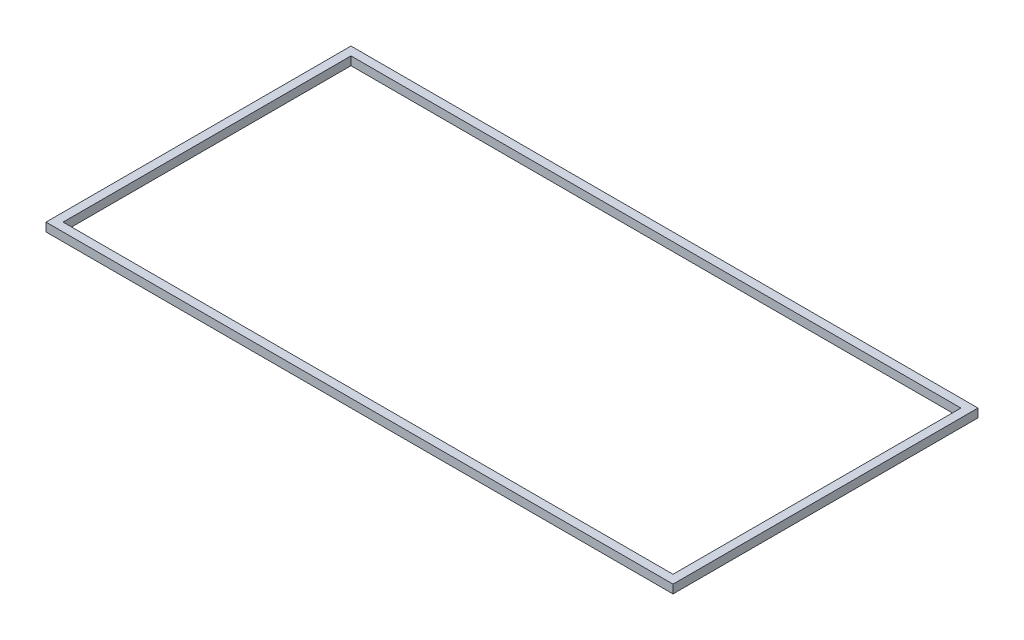
ISO-10303-21;
HEADER;
FILE_DESCRIPTION(('STEP AP214'),'2;1');
FILE_NAME('part.step','',(''),(''),'','','');
FILE_SCHEMA(('AUTOMOTIVE_DESIGN { 1 0 10303 214 1 1 1 1 }'));
ENDSEC;
DATA;
#1=APPLICATION_CONTEXT('core data for automotive mechanical design processes');
#2=APPLICATION_PROTOCOL_DEFINITION('international standard','automotive_design',2000,#1);
#3=PRODUCT_CONTEXT('',#1,'mechanical');
#4=PRODUCT('Part','Part','',(#3));
#5=PRODUCT_RELATED_PRODUCT_CATEGORY('part','',(#4));
#6=PRODUCT_DEFINITION_FORMATION('','',#4);
#7=PRODUCT_DEFINITION_CONTEXT('part definition',#1,'design');
#8=PRODUCT_DEFINITION('design','',#6,#7);
#9=PRODUCT_DEFINITION_SHAPE('','',#8);
#10=(LENGTH_UNIT() NAMED_UNIT(*) SI_UNIT(.MILLI.,.METRE.));
#11=(NAMED_UNIT(*) PLANE_ANGLE_UNIT() SI_UNIT($,.RADIAN.));
#12=(NAMED_UNIT(*) SI_UNIT($,.STERADIAN.) SOLID_ANGLE_UNIT());
#13=UNCERTAINTY_MEASURE_WITH_UNIT(LENGTH_MEASURE(1.E-05),#10,'distance_accuracy_value','');
#14=(GEOMETRIC_REPRESENTATION_CONTEXT(3) GLOBAL_UNCERTAINTY_ASSIGNED_CONTEXT((#13)) GLOBAL_UNIT_ASSIGNED_CONTEXT((#10,
#11,#12)) REPRESENTATION_CONTEXT('',''));
#15=CARTESIAN_POINT('',(0.,0.,0.));
#16=DIRECTION('',(0.,0.,1.));
#17=DIRECTION('',(1.,0.,0.));
#18=AXIS2_PLACEMENT_3D('',#15,#16,#17);
#19=CARTESIAN_POINT('',(0.,14.,0.));
#20=DIRECTION('',(0.,0.,1.));
#21=DIRECTION('',(1.,0.,0.));
#22=AXIS2_PLACEMENT_3D('',#19,#20,#21);
#23=PLANE('',#22);
#24=DIRECTION('',(-1.,0.,0.));
#25=VECTOR('',#24,1.);
#26=CARTESIAN_POINT('',(0.,0.,0.));
#27=LINE('',#26,#25);
#28=CARTESIAN_POINT('',(0.,0.,0.));
#29=VERTEX_POINT('',#28);
#30=CARTESIAN_POINT('',(-1028.,0.,0.));
#31=VERTEX_POINT('',#30);
#32=EDGE_CURVE('E129',#29,#31,#27,.T.);
#33=ORIENTED_EDGE('',*,*,#32,.T.);
#34=DIRECTION('',(0.,-1.,0.));
#35=VECTOR('',#34,1.);
#36=CARTESIAN_POINT('',(-1028.,14.,0.));
#37=LINE('',#36,#35);
#38=CARTESIAN_POINT('',(-1028.,14.,0.));
#39=VERTEX_POINT('',#38);
#40=EDGE_CURVE('E12',#39,#31,#37,.T.);
#41=ORIENTED_EDGE('',*,*,#40,.F.);
#42=DIRECTION('',(-1.,0.,0.));
#43=VECTOR('',#42,1.);
#44=CARTESIAN_POINT('',(0.,14.,0.));
#45=LINE('',#44,#43);
#46=CARTESIAN_POINT('',(0.,14.,0.));
#47=VERTEX_POINT('',#46);
#48=EDGE_CURVE('E158',#47,#39,#45,.T.);
#49=ORIENTED_EDGE('',*,*,#48,.F.);
#50=DIRECTION('',(0.,-1.,0.));
#51=VECTOR('',#50,1.);
#52=CARTESIAN_POINT('',(0.,14.,0.));
#53=LINE('',#52,#51);
#54=EDGE_CURVE('E170',#47,#29,#53,.T.);
#55=ORIENTED_EDGE('',*,*,#54,.T.);
#56=EDGE_LOOP('',(#33,#41,#49,#55));
#57=FACE_BOUND('',#56,.T.);
#58=ADVANCED_FACE('F57',(#57),#23,.F.);
#59=CARTESIAN_POINT('',(-1028.,14.,0.));
#60=DIRECTION('',(1.,0.,0.));
#61=DIRECTION('',(0.,0.,-1.));
#62=AXIS2_PLACEMENT_3D('',#59,#60,#61);
#63=PLANE('',#62);
#64=DIRECTION('',(0.,0.,1.));
#65=VECTOR('',#64,1.);
#66=CARTESIAN_POINT('',(-1028.,0.,0.));
#67=LINE('',#66,#65);
#68=CARTESIAN_POINT('',(-1028.,0.,500.));
#69=VERTEX_POINT('',#68);
#70=EDGE_CURVE('E173',#31,#69,#67,.T.);
#71=ORIENTED_EDGE('',*,*,#70,.T.);
#72=DIRECTION('',(0.,-1.,0.));
#73=VECTOR('',#72,1.);
#74=CARTESIAN_POINT('',(-1028.,14.,500.));
#75=LINE('',#74,#73);
#76=CARTESIAN_POINT('',(-1028.,14.,500.));
#77=VERTEX_POINT('',#76);
#78=EDGE_CURVE('E64',#77,#69,#75,.T.);
#79=ORIENTED_EDGE('',*,*,#78,.F.);
#80=DIRECTION('',(0.,0.,1.));
#81=VECTOR('',#80,1.);
#82=CARTESIAN_POINT('',(-1028.,14.,0.));
#83=LINE('',#82,#81);
#84=EDGE_CURVE('E161',#39,#77,#83,.T.);
#85=ORIENTED_EDGE('',*,*,#84,.F.);
#86=ORIENTED_EDGE('',*,*,#40,.T.);
#87=EDGE_LOOP('',(#71,#79,#85,#86));
#88=FACE_BOUND('',#87,.T.);
#89=ADVANCED_FACE('F189',(#88),#63,.F.);
#90=CARTESIAN_POINT('',(0.,14.,500.));
#91=DIRECTION('',(0.,0.,1.));
#92=DIRECTION('',(1.,0.,0.));
#93=AXIS2_PLACEMENT_3D('',#90,#91,#92);
#94=PLANE('',#93);
#95=DIRECTION('',(-1.,0.,0.));
#96=VECTOR('',#95,1.);
#97=CARTESIAN_POINT('',(0.,0.,500.));
#98=LINE('',#97,#96);
#99=CARTESIAN_POINT('',(0.,0.,500.));
#100=VERTEX_POINT('',#99);
#101=EDGE_CURVE('E176',#100,#69,#98,.T.);
#102=ORIENTED_EDGE('',*,*,#101,.F.);
#103=DIRECTION('',(0.,-1.,0.));
#104=VECTOR('',#103,1.);
#105=CARTESIAN_POINT('',(0.,14.,500.));
#106=LINE('',#105,#104);
#107=CARTESIAN_POINT('',(0.,14.,500.));
#108=VERTEX_POINT('',#107);
#109=EDGE_CURVE('E182',#108,#100,#106,.T.);
#110=ORIENTED_EDGE('',*,*,#109,.F.);
#111=DIRECTION('',(-1.,0.,0.));
#112=VECTOR('',#111,1.);
#113=CARTESIAN_POINT('',(0.,14.,500.));
#114=LINE('',#113,#112);
#115=EDGE_CURVE('E164',#108,#77,#114,.T.);
#116=ORIENTED_EDGE('',*,*,#115,.T.);
#117=ORIENTED_EDGE('',*,*,#78,.T.);
#118=EDGE_LOOP('',(#102,#110,#116,#117));
#119=FACE_BOUND('',#118,.T.);
#120=ADVANCED_FACE('F186',(#119),#94,.T.);
#121=CARTESIAN_POINT('',(0.,14.,0.));
#122=DIRECTION('',(1.,0.,0.));
#123=DIRECTION('',(0.,0.,-1.));
#124=AXIS2_PLACEMENT_3D('',#121,#122,#123);
#125=PLANE('',#124);
#126=DIRECTION('',(0.,0.,1.));
#127=VECTOR('',#126,1.);
#128=CARTESIAN_POINT('',(0.,0.,0.));
#129=LINE('',#128,#127);
#130=EDGE_CURVE('E162',#29,#100,#129,.T.);
#131=ORIENTED_EDGE('',*,*,#130,.F.);
#132=ORIENTED_EDGE('',*,*,#54,.F.);
#133=DIRECTION('',(0.,0.,1.));
#134=VECTOR('',#133,1.);
#135=CARTESIAN_POINT('',(0.,14.,0.));
#136=LINE('',#135,#134);
#137=EDGE_CURVE('E167',#47,#108,#136,.T.);
#138=ORIENTED_EDGE('',*,*,#137,.T.);
#139=ORIENTED_EDGE('',*,*,#109,.T.);
#140=EDGE_LOOP('',(#131,#132,#138,#139));
#141=FACE_BOUND('',#140,.T.);
#142=ADVANCED_FACE('F196',(#141),#125,.T.);
#143=CARTESIAN_POINT('',(0.,14.,0.));
#144=DIRECTION('',(0.,1.,0.));
#145=DIRECTION('',(0.,0.,1.));
#146=AXIS2_PLACEMENT_3D('',#143,#144,#145);
#147=PLANE('',#146);
#148=DIRECTION('',(0.,0.,1.));
#149=VECTOR('',#148,1.);
#150=CARTESIAN_POINT('',(-14.,14.,0.));
#151=LINE('',#150,#149);
#152=CARTESIAN_POINT('',(-14.,14.,14.));
#153=VERTEX_POINT('',#152);
#154=CARTESIAN_POINT('',(-14.,14.,486.));
#155=VERTEX_POINT('',#154);
#156=EDGE_CURVE('E133',#153,#155,#151,.T.);
#157=ORIENTED_EDGE('',*,*,#156,.T.);
#158=DIRECTION('',(-1.,0.,0.));
#159=VECTOR('',#158,1.);
#160=CARTESIAN_POINT('',(0.,14.,486.));
#161=LINE('',#160,#159);
#162=CARTESIAN_POINT('',(-1014.,14.,486.));
#163=VERTEX_POINT('',#162);
#164=EDGE_CURVE('E145',#155,#163,#161,.T.);
#165=ORIENTED_EDGE('',*,*,#164,.T.);
#166=DIRECTION('',(0.,0.,1.));
#167=VECTOR('',#166,1.);
#168=CARTESIAN_POINT('',(-1014.,14.,0.));
#169=LINE('',#168,#167);
#170=CARTESIAN_POINT('',(-1014.,14.,14.));
#171=VERTEX_POINT('',#170);
#172=EDGE_CURVE('E143',#171,#163,#169,.T.);
#173=ORIENTED_EDGE('',*,*,#172,.F.);
#174=DIRECTION('',(-1.,0.,0.));
#175=VECTOR('',#174,1.);
#176=CARTESIAN_POINT('',(0.,14.,14.));
#177=LINE('',#176,#175);
#178=EDGE_CURVE('E125',#153,#171,#177,.T.);
#179=ORIENTED_EDGE('',*,*,#178,.F.);
#180=EDGE_LOOP('',(#157,#165,#173,#179));
#181=FACE_BOUND('',#180,.T.);
#182=ORIENTED_EDGE('',*,*,#48,.T.);
#183=ORIENTED_EDGE('',*,*,#84,.T.);
#184=ORIENTED_EDGE('',*,*,#115,.F.);
#185=ORIENTED_EDGE('',*,*,#137,.F.);
#186=EDGE_LOOP('',(#182,#183,#184,#185));
#187=FACE_BOUND('',#186,.T.);
#188=ADVANCED_FACE('F141',(#181,#187),#147,.T.);
#189=CARTESIAN_POINT('',(0.,0.,0.));
#190=DIRECTION('',(0.,1.,0.));
#191=DIRECTION('',(0.,0.,1.));
#192=AXIS2_PLACEMENT_3D('',#189,#190,#191);
#193=PLANE('',#192);
#194=DIRECTION('',(-1.,0.,0.));
#195=VECTOR('',#194,1.);
#196=CARTESIAN_POINT('',(0.,0.,486.));
#197=LINE('',#196,#195);
#198=CARTESIAN_POINT('',(-14.,0.,486.));
#199=VERTEX_POINT('',#198);
#200=CARTESIAN_POINT('',(-1014.,0.,486.));
#201=VERTEX_POINT('',#200);
#202=EDGE_CURVE('E138',#199,#201,#197,.T.);
#203=ORIENTED_EDGE('',*,*,#202,.F.);
#204=DIRECTION('',(0.,0.,1.));
#205=VECTOR('',#204,1.);
#206=CARTESIAN_POINT('',(-14.,0.,0.));
#207=LINE('',#206,#205);
#208=CARTESIAN_POINT('',(-14.,0.,14.));
#209=VERTEX_POINT('',#208);
#210=EDGE_CURVE('E79',#209,#199,#207,.T.);
#211=ORIENTED_EDGE('',*,*,#210,.F.);
#212=DIRECTION('',(-1.,0.,0.));
#213=VECTOR('',#212,1.);
#214=CARTESIAN_POINT('',(0.,0.,14.));
#215=LINE('',#214,#213);
#216=CARTESIAN_POINT('',(-1014.,0.,14.));
#217=VERTEX_POINT('',#216);
#218=EDGE_CURVE('E128',#209,#217,#215,.T.);
#219=ORIENTED_EDGE('',*,*,#218,.T.);
#220=DIRECTION('',(0.,0.,1.));
#221=VECTOR('',#220,1.);
#222=CARTESIAN_POINT('',(-1014.,0.,0.));
#223=LINE('',#222,#221);
#224=EDGE_CURVE('E151',#217,#201,#223,.T.);
#225=ORIENTED_EDGE('',*,*,#224,.T.);
#226=EDGE_LOOP('',(#203,#211,#219,#225));
#227=FACE_BOUND('',#226,.T.);
#228=ORIENTED_EDGE('',*,*,#32,.F.);
#229=ORIENTED_EDGE('',*,*,#130,.T.);
#230=ORIENTED_EDGE('',*,*,#101,.T.);
#231=ORIENTED_EDGE('',*,*,#70,.F.);
#232=EDGE_LOOP('',(#228,#229,#230,#231));
#233=FACE_BOUND('',#232,.T.);
#234=ADVANCED_FACE('F193',(#227,#233),#193,.F.);
#235=CARTESIAN_POINT('',(-14.,14.,0.));
#236=DIRECTION('',(1.,0.,0.));
#237=DIRECTION('',(0.,0.,-1.));
#238=AXIS2_PLACEMENT_3D('',#235,#236,#237);
#239=PLANE('',#238);
#240=ORIENTED_EDGE('',*,*,#210,.T.);
#241=DIRECTION('',(0.,-1.,0.));
#242=VECTOR('',#241,1.);
#243=CARTESIAN_POINT('',(-14.,14.,486.));
#244=LINE('',#243,#242);
#245=EDGE_CURVE('E135',#155,#199,#244,.T.);
#246=ORIENTED_EDGE('',*,*,#245,.F.);
#247=ORIENTED_EDGE('',*,*,#156,.F.);
#248=DIRECTION('',(0.,-1.,0.));
#249=VECTOR('',#248,1.);
#250=CARTESIAN_POINT('',(-14.,14.,14.));
#251=LINE('',#250,#249);
#252=EDGE_CURVE('E121',#153,#209,#251,.T.);
#253=ORIENTED_EDGE('',*,*,#252,.T.);
#254=EDGE_LOOP('',(#240,#246,#247,#253));
#255=FACE_BOUND('',#254,.T.);
#256=ADVANCED_FACE('F134',(#255),#239,.F.);
#257=CARTESIAN_POINT('',(0.,14.,14.));
#258=DIRECTION('',(0.,0.,1.));
#259=DIRECTION('',(1.,0.,0.));
#260=AXIS2_PLACEMENT_3D('',#257,#258,#259);
#261=PLANE('',#260);
#262=ORIENTED_EDGE('',*,*,#218,.F.);
#263=ORIENTED_EDGE('',*,*,#252,.F.);
#264=ORIENTED_EDGE('',*,*,#178,.T.);
#265=DIRECTION('',(0.,-1.,0.));
#266=VECTOR('',#265,1.);
#267=CARTESIAN_POINT('',(-1014.,14.,14.));
#268=LINE('',#267,#266);
#269=EDGE_CURVE('E130',#171,#217,#268,.T.);
#270=ORIENTED_EDGE('',*,*,#269,.T.);
#271=EDGE_LOOP('',(#262,#263,#264,#270));
#272=FACE_BOUND('',#271,.T.);
#273=ADVANCED_FACE('F123',(#272),#261,.T.);
#274=CARTESIAN_POINT('',(-1014.,14.,0.));
#275=DIRECTION('',(1.,0.,0.));
#276=DIRECTION('',(0.,0.,-1.));
#277=AXIS2_PLACEMENT_3D('',#274,#275,#276);
#278=PLANE('',#277);
#279=ORIENTED_EDGE('',*,*,#224,.F.);
#280=ORIENTED_EDGE('',*,*,#269,.F.);
#281=ORIENTED_EDGE('',*,*,#172,.T.);
#282=DIRECTION('',(0.,-1.,0.));
#283=VECTOR('',#282,1.);
#284=CARTESIAN_POINT('',(-1014.,14.,486.));
#285=LINE('',#284,#283);
#286=EDGE_CURVE('E71',#163,#201,#285,.T.);
#287=ORIENTED_EDGE('',*,*,#286,.T.);
#288=EDGE_LOOP('',(#279,#280,#281,#287));
#289=FACE_BOUND('',#288,.T.);
#290=ADVANCED_FACE('F220',(#289),#278,.T.);
#291=CARTESIAN_POINT('',(0.,14.,486.));
#292=DIRECTION('',(0.,0.,1.));
#293=DIRECTION('',(1.,0.,0.));
#294=AXIS2_PLACEMENT_3D('',#291,#292,#293);
#295=PLANE('',#294);
#296=ORIENTED_EDGE('',*,*,#202,.T.);
#297=ORIENTED_EDGE('',*,*,#286,.F.);
#298=ORIENTED_EDGE('',*,*,#164,.F.);
#299=ORIENTED_EDGE('',*,*,#245,.T.);
#300=EDGE_LOOP('',(#296,#297,#298,#299));
#301=FACE_BOUND('',#300,.T.);
#302=ADVANCED_FACE('F223',(#301),#295,.F.);
#303=CLOSED_SHELL('',(#58,#89,#120,#142,#188,#234,#256,#273,#290,#302));
#304=MANIFOLD_SOLID_BREP('B2',#303);
#305=ADVANCED_BREP_SHAPE_REPRESENTATION('',(#18,#304),#14);
#306=SHAPE_DEFINITION_REPRESENTATION(#9,#305);
ENDSEC;
END-ISO-10303-21;
